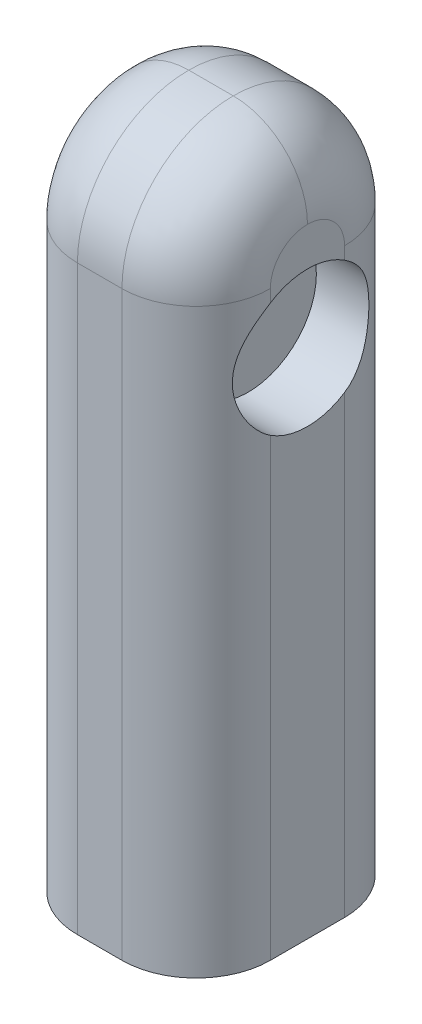
ISO-10303-21;
HEADER;
FILE_DESCRIPTION(('STEP AP214'),'2;1');
FILE_NAME('part.step','',(''),(''),'','','');
FILE_SCHEMA(('AUTOMOTIVE_DESIGN { 1 0 10303 214 1 1 1 1 }'));
ENDSEC;
DATA;
#1=APPLICATION_CONTEXT('core data for automotive mechanical design processes');
#2=APPLICATION_PROTOCOL_DEFINITION('international standard','automotive_design',2000,#1);
#3=PRODUCT_CONTEXT('',#1,'mechanical');
#4=PRODUCT('Part','Part','',(#3));
#5=PRODUCT_RELATED_PRODUCT_CATEGORY('part','',(#4));
#6=PRODUCT_DEFINITION_FORMATION('','',#4);
#7=PRODUCT_DEFINITION_CONTEXT('part definition',#1,'design');
#8=PRODUCT_DEFINITION('design','',#6,#7);
#9=PRODUCT_DEFINITION_SHAPE('','',#8);
#10=(LENGTH_UNIT() NAMED_UNIT(*) SI_UNIT(.MILLI.,.METRE.));
#11=(NAMED_UNIT(*) PLANE_ANGLE_UNIT() SI_UNIT($,.RADIAN.));
#12=(NAMED_UNIT(*) SI_UNIT($,.STERADIAN.) SOLID_ANGLE_UNIT());
#13=UNCERTAINTY_MEASURE_WITH_UNIT(LENGTH_MEASURE(1.E-05),#10,'distance_accuracy_value','');
#14=(GEOMETRIC_REPRESENTATION_CONTEXT(3) GLOBAL_UNCERTAINTY_ASSIGNED_CONTEXT((#13)) GLOBAL_UNIT_ASSIGNED_CONTEXT((#10,
#11,#12)) REPRESENTATION_CONTEXT('',''));
#15=CARTESIAN_POINT('',(0.,0.,0.));
#16=DIRECTION('',(0.,0.,1.));
#17=DIRECTION('',(1.,0.,0.));
#18=AXIS2_PLACEMENT_3D('',#15,#16,#17);
#19=CARTESIAN_POINT('',(13.,93.4,-15.));
#20=DIRECTION('',(-1.,0.,0.));
#21=DIRECTION('',(0.,0.,1.));
#22=AXIS2_PLACEMENT_3D('',#19,#20,#21);
#23=PLANE('',#22);
#24=DIRECTION('',(0.,0.,-1.));
#25=VECTOR('',#24,1.);
#26=CARTESIAN_POINT('',(13.,0.,-15.));
#27=LINE('',#26,#25);
#28=CARTESIAN_POINT('',(13.,0.,5.));
#29=VERTEX_POINT('',#28);
#30=CARTESIAN_POINT('',(13.,0.,-5.));
#31=VERTEX_POINT('',#30);
#32=EDGE_CURVE('E352',#29,#31,#27,.T.);
#33=ORIENTED_EDGE('',*,*,#32,.T.);
#34=DIRECTION('',(0.,-1.,0.));
#35=VECTOR('',#34,1.);
#36=CARTESIAN_POINT('',(13.,93.4,-5.));
#37=LINE('',#36,#35);
#38=CARTESIAN_POINT('',(13.,61.2773061694769,-5.));
#39=VERTEX_POINT('',#38);
#40=EDGE_CURVE('E298',#31,#39,#37,.F.);
#41=ORIENTED_EDGE('',*,*,#40,.T.);
#42=CARTESIAN_POINT('',(13.,69.,0.));
#43=DIRECTION('',(1.,0.,0.));
#44=DIRECTION('',(0.,0.,-1.));
#45=AXIS2_PLACEMENT_3D('',#42,#43,#44);
#46=CIRCLE('',#45,9.20000000000001);
#47=CARTESIAN_POINT('',(13.,61.2773061694769,5.));
#48=VERTEX_POINT('',#47);
#49=EDGE_CURVE('E290',#48,#39,#46,.T.);
#50=ORIENTED_EDGE('',*,*,#49,.F.);
#51=DIRECTION('',(0.,-1.,0.));
#52=VECTOR('',#51,1.);
#53=CARTESIAN_POINT('',(13.,93.4,5.));
#54=LINE('',#53,#52);
#55=EDGE_CURVE('E306',#48,#29,#54,.T.);
#56=ORIENTED_EDGE('',*,*,#55,.T.);
#57=EDGE_LOOP('',(#33,#41,#50,#56));
#58=FACE_BOUND('',#57,.T.);
#59=ADVANCED_FACE('F35',(#58),#23,.F.);
#60=CARTESIAN_POINT('',(-13.,93.4,-15.));
#61=DIRECTION('',(1.,0.,0.));
#62=DIRECTION('',(0.,0.,-1.));
#63=AXIS2_PLACEMENT_3D('',#60,#61,#62);
#64=PLANE('',#63);
#65=DIRECTION('',(0.,0.,1.));
#66=VECTOR('',#65,1.);
#67=CARTESIAN_POINT('',(-13.,0.,-15.));
#68=LINE('',#67,#66);
#69=CARTESIAN_POINT('',(-13.,0.,-5.));
#70=VERTEX_POINT('',#69);
#71=CARTESIAN_POINT('',(-13.,0.,5.));
#72=VERTEX_POINT('',#71);
#73=EDGE_CURVE('E357',#70,#72,#68,.T.);
#74=ORIENTED_EDGE('',*,*,#73,.T.);
#75=DIRECTION('',(0.,-1.,0.));
#76=VECTOR('',#75,1.);
#77=CARTESIAN_POINT('',(-13.,93.4,5.));
#78=LINE('',#77,#76);
#79=CARTESIAN_POINT('',(-13.,61.2773061694769,5.));
#80=VERTEX_POINT('',#79);
#81=EDGE_CURVE('E187',#72,#80,#78,.F.);
#82=ORIENTED_EDGE('',*,*,#81,.T.);
#83=CARTESIAN_POINT('',(-13.,69.,0.));
#84=DIRECTION('',(-1.,0.,0.));
#85=DIRECTION('',(0.,0.,1.));
#86=AXIS2_PLACEMENT_3D('',#83,#84,#85);
#87=CIRCLE('',#86,9.20000000000001);
#88=CARTESIAN_POINT('',(-13.,61.2773061694769,-5.));
#89=VERTEX_POINT('',#88);
#90=EDGE_CURVE('E343',#89,#80,#87,.T.);
#91=ORIENTED_EDGE('',*,*,#90,.F.);
#92=DIRECTION('',(0.,-1.,0.));
#93=VECTOR('',#92,1.);
#94=CARTESIAN_POINT('',(-13.,93.4,-5.));
#95=LINE('',#94,#93);
#96=EDGE_CURVE('E178',#89,#70,#95,.T.);
#97=ORIENTED_EDGE('',*,*,#96,.T.);
#98=EDGE_LOOP('',(#74,#82,#91,#97));
#99=FACE_BOUND('',#98,.T.);
#100=ADVANCED_FACE('F259',(#99),#64,.F.);
#101=CARTESIAN_POINT('',(13.,76.7226938305231,-5.));
#102=VERTEX_POINT('',#101);
#103=CARTESIAN_POINT('',(13.,76.7226938305231,5.));
#104=VERTEX_POINT('',#103);
#105=EDGE_CURVE('E281',#102,#104,#46,.T.);
#106=ORIENTED_EDGE('',*,*,#105,.F.);
#107=DIRECTION('',(0.,-1.,0.));
#108=VECTOR('',#107,1.);
#109=CARTESIAN_POINT('',(13.,93.4,-5.));
#110=LINE('',#109,#108);
#111=CARTESIAN_POINT('',(13.,78.4,-5.));
#112=VERTEX_POINT('',#111);
#113=EDGE_CURVE('E283',#102,#112,#110,.F.);
#114=ORIENTED_EDGE('',*,*,#113,.T.);
#115=CARTESIAN_POINT('',(13.,78.4,0.));
#116=DIRECTION('',(-1.,0.,0.));
#117=DIRECTION('',(0.,0.,1.));
#118=AXIS2_PLACEMENT_3D('',#115,#116,#117);
#119=CIRCLE('',#118,5.);
#120=CARTESIAN_POINT('',(13.,83.4,0.));
#121=VERTEX_POINT('',#120);
#122=EDGE_CURVE('E299',#112,#121,#119,.F.);
#123=ORIENTED_EDGE('',*,*,#122,.T.);
#124=CARTESIAN_POINT('',(13.,78.4,0.));
#125=DIRECTION('',(-1.,0.,0.));
#126=DIRECTION('',(0.,0.,1.));
#127=AXIS2_PLACEMENT_3D('',#124,#125,#126);
#128=CIRCLE('',#127,5.);
#129=CARTESIAN_POINT('',(13.,78.4,5.));
#130=VERTEX_POINT('',#129);
#131=EDGE_CURVE('E301',#121,#130,#128,.F.);
#132=ORIENTED_EDGE('',*,*,#131,.T.);
#133=DIRECTION('',(0.,-1.,0.));
#134=VECTOR('',#133,1.);
#135=CARTESIAN_POINT('',(13.,93.4,5.));
#136=LINE('',#135,#134);
#137=EDGE_CURVE('E286',#130,#104,#136,.T.);
#138=ORIENTED_EDGE('',*,*,#137,.T.);
#139=EDGE_LOOP('',(#106,#114,#123,#132,#138));
#140=FACE_BOUND('',#139,.T.);
#141=ADVANCED_FACE('F262',(#140),#23,.F.);
#142=CARTESIAN_POINT('',(-13.,93.4,-15.));
#143=DIRECTION('',(0.,0.,1.));
#144=DIRECTION('',(1.,0.,0.));
#145=AXIS2_PLACEMENT_3D('',#142,#143,#144);
#146=PLANE('',#145);
#147=DIRECTION('',(-1.,0.,0.));
#148=VECTOR('',#147,1.);
#149=CARTESIAN_POINT('',(13.,78.4,-15.));
#150=LINE('',#149,#148);
#151=CARTESIAN_POINT('',(-3.00000000000001,78.4,-15.));
#152=VERTEX_POINT('',#151);
#153=CARTESIAN_POINT('',(2.99999999999999,78.4,-15.));
#154=VERTEX_POINT('',#153);
#155=EDGE_CURVE('E142',#152,#154,#150,.F.);
#156=ORIENTED_EDGE('',*,*,#155,.T.);
#157=DIRECTION('',(0.,-1.,0.));
#158=VECTOR('',#157,1.);
#159=CARTESIAN_POINT('',(2.99999999999999,93.4,-15.));
#160=LINE('',#159,#158);
#161=CARTESIAN_POINT('',(2.99999999999999,0.,-15.));
#162=VERTEX_POINT('',#161);
#163=EDGE_CURVE('E312',#154,#162,#160,.T.);
#164=ORIENTED_EDGE('',*,*,#163,.T.);
#165=DIRECTION('',(-1.,0.,0.));
#166=VECTOR('',#165,1.);
#167=CARTESIAN_POINT('',(-13.,0.,-15.));
#168=LINE('',#167,#166);
#169=CARTESIAN_POINT('',(-3.00000000000001,0.,-15.));
#170=VERTEX_POINT('',#169);
#171=EDGE_CURVE('E355',#162,#170,#168,.T.);
#172=ORIENTED_EDGE('',*,*,#171,.T.);
#173=DIRECTION('',(0.,-1.,0.));
#174=VECTOR('',#173,1.);
#175=CARTESIAN_POINT('',(-3.00000000000001,93.4,-15.));
#176=LINE('',#175,#174);
#177=EDGE_CURVE('E315',#170,#152,#176,.F.);
#178=ORIENTED_EDGE('',*,*,#177,.T.);
#179=EDGE_LOOP('',(#156,#164,#172,#178));
#180=FACE_BOUND('',#179,.T.);
#181=ADVANCED_FACE('F273',(#180),#146,.F.);
#182=CARTESIAN_POINT('',(-13.,76.7226938305231,5.));
#183=VERTEX_POINT('',#182);
#184=CARTESIAN_POINT('',(-13.,76.7226938305231,-5.));
#185=VERTEX_POINT('',#184);
#186=EDGE_CURVE('E344',#183,#185,#87,.T.);
#187=ORIENTED_EDGE('',*,*,#186,.F.);
#188=DIRECTION('',(0.,-1.,0.));
#189=VECTOR('',#188,1.);
#190=CARTESIAN_POINT('',(-13.,93.4,5.));
#191=LINE('',#190,#189);
#192=CARTESIAN_POINT('',(-13.,78.4,5.));
#193=VERTEX_POINT('',#192);
#194=EDGE_CURVE('E185',#183,#193,#191,.F.);
#195=ORIENTED_EDGE('',*,*,#194,.T.);
#196=CARTESIAN_POINT('',(-13.,78.4,0.));
#197=DIRECTION('',(1.,0.,0.));
#198=DIRECTION('',(0.,0.,-1.));
#199=AXIS2_PLACEMENT_3D('',#196,#197,#198);
#200=CIRCLE('',#199,5.);
#201=CARTESIAN_POINT('',(-13.,83.4,0.));
#202=VERTEX_POINT('',#201);
#203=EDGE_CURVE('E160',#193,#202,#200,.F.);
#204=ORIENTED_EDGE('',*,*,#203,.T.);
#205=CARTESIAN_POINT('',(-13.,78.4,0.));
#206=DIRECTION('',(1.,0.,0.));
#207=DIRECTION('',(0.,0.,-1.));
#208=AXIS2_PLACEMENT_3D('',#205,#206,#207);
#209=CIRCLE('',#208,5.);
#210=CARTESIAN_POINT('',(-13.,78.4,-5.));
#211=VERTEX_POINT('',#210);
#212=EDGE_CURVE('E182',#202,#211,#209,.F.);
#213=ORIENTED_EDGE('',*,*,#212,.T.);
#214=DIRECTION('',(0.,-1.,0.));
#215=VECTOR('',#214,1.);
#216=CARTESIAN_POINT('',(-13.,93.4,-5.));
#217=LINE('',#216,#215);
#218=EDGE_CURVE('E180',#211,#185,#217,.T.);
#219=ORIENTED_EDGE('',*,*,#218,.T.);
#220=EDGE_LOOP('',(#187,#195,#204,#213,#219));
#221=FACE_BOUND('',#220,.T.);
#222=ADVANCED_FACE('F268',(#221),#64,.F.);
#223=CARTESIAN_POINT('',(-13.,93.4,15.));
#224=DIRECTION('',(0.,0.,-1.));
#225=DIRECTION('',(-1.,0.,0.));
#226=AXIS2_PLACEMENT_3D('',#223,#224,#225);
#227=PLANE('',#226);
#228=DIRECTION('',(1.,0.,0.));
#229=VECTOR('',#228,1.);
#230=CARTESIAN_POINT('',(-13.,0.,15.));
#231=LINE('',#230,#229);
#232=CARTESIAN_POINT('',(-3.00000000000001,0.,15.));
#233=VERTEX_POINT('',#232);
#234=CARTESIAN_POINT('',(2.99999999999999,0.,15.));
#235=VERTEX_POINT('',#234);
#236=EDGE_CURVE('E143',#233,#235,#231,.T.);
#237=ORIENTED_EDGE('',*,*,#236,.T.);
#238=DIRECTION('',(0.,-1.,0.));
#239=VECTOR('',#238,1.);
#240=CARTESIAN_POINT('',(2.99999999999999,93.4,15.));
#241=LINE('',#240,#239);
#242=CARTESIAN_POINT('',(2.99999999999999,78.4,15.));
#243=VERTEX_POINT('',#242);
#244=EDGE_CURVE('E11',#235,#243,#241,.F.);
#245=ORIENTED_EDGE('',*,*,#244,.T.);
#246=DIRECTION('',(1.,0.,0.));
#247=VECTOR('',#246,1.);
#248=CARTESIAN_POINT('',(-13.,78.4,15.));
#249=LINE('',#248,#247);
#250=CARTESIAN_POINT('',(-3.00000000000001,78.4,15.));
#251=VERTEX_POINT('',#250);
#252=EDGE_CURVE('E135',#243,#251,#249,.F.);
#253=ORIENTED_EDGE('',*,*,#252,.T.);
#254=DIRECTION('',(0.,-1.,0.));
#255=VECTOR('',#254,1.);
#256=CARTESIAN_POINT('',(-3.00000000000001,93.4,15.));
#257=LINE('',#256,#255);
#258=EDGE_CURVE('E139',#251,#233,#257,.T.);
#259=ORIENTED_EDGE('',*,*,#258,.T.);
#260=EDGE_LOOP('',(#237,#245,#253,#259));
#261=FACE_BOUND('',#260,.T.);
#262=ADVANCED_FACE('F137',(#261),#227,.F.);
#263=CARTESIAN_POINT('',(0.,0.,0.));
#264=DIRECTION('',(0.,1.,0.));
#265=DIRECTION('',(0.,0.,1.));
#266=AXIS2_PLACEMENT_3D('',#263,#264,#265);
#267=PLANE('',#266);
#268=ORIENTED_EDGE('',*,*,#171,.F.);
#269=CARTESIAN_POINT('',(2.99999999999999,0.,-5.));
#270=DIRECTION('',(0.,1.,0.));
#271=DIRECTION('',(0.,0.,1.));
#272=AXIS2_PLACEMENT_3D('',#269,#270,#271);
#273=CIRCLE('',#272,10.);
#274=EDGE_CURVE('E308',#162,#31,#273,.F.);
#275=ORIENTED_EDGE('',*,*,#274,.T.);
#276=ORIENTED_EDGE('',*,*,#32,.F.);
#277=CARTESIAN_POINT('',(2.99999999999999,0.,5.));
#278=DIRECTION('',(0.,1.,0.));
#279=DIRECTION('',(0.,0.,1.));
#280=AXIS2_PLACEMENT_3D('',#277,#278,#279);
#281=CIRCLE('',#280,10.);
#282=EDGE_CURVE('E310',#29,#235,#281,.F.);
#283=ORIENTED_EDGE('',*,*,#282,.T.);
#284=ORIENTED_EDGE('',*,*,#236,.F.);
#285=CARTESIAN_POINT('',(-3.00000000000001,0.,5.));
#286=DIRECTION('',(0.,1.,0.));
#287=DIRECTION('',(0.,0.,1.));
#288=AXIS2_PLACEMENT_3D('',#285,#286,#287);
#289=CIRCLE('',#288,10.);
#290=EDGE_CURVE('E168',#233,#72,#289,.F.);
#291=ORIENTED_EDGE('',*,*,#290,.T.);
#292=ORIENTED_EDGE('',*,*,#73,.F.);
#293=CARTESIAN_POINT('',(-3.00000000000001,0.,-5.));
#294=DIRECTION('',(0.,1.,0.));
#295=DIRECTION('',(0.,0.,1.));
#296=AXIS2_PLACEMENT_3D('',#293,#294,#295);
#297=CIRCLE('',#296,10.);
#298=EDGE_CURVE('E169',#70,#170,#297,.F.);
#299=ORIENTED_EDGE('',*,*,#298,.T.);
#300=EDGE_LOOP('',(#268,#275,#276,#283,#284,#291,#292,#299));
#301=FACE_BOUND('',#300,.T.);
#302=ADVANCED_FACE('F222',(#301),#267,.F.);
#303=CARTESIAN_POINT('',(4.99999999999999,69.,0.));
#304=DIRECTION('',(1.,0.,0.));
#305=DIRECTION('',(0.,0.,-1.));
#306=AXIS2_PLACEMENT_3D('',#303,#304,#305);
#307=CYLINDRICAL_SURFACE('',#306,9.20000000000001);
#308=CARTESIAN_POINT('',(4.99999999999999,69.,0.));
#309=DIRECTION('',(1.,0.,0.));
#310=DIRECTION('',(0.,0.,-1.));
#311=AXIS2_PLACEMENT_3D('',#308,#309,#310);
#312=CIRCLE('',#311,9.20000000000001);
#313=CARTESIAN_POINT('',(4.99999999999999,69.,-9.20000000000001));
#314=VERTEX_POINT('',#313);
#315=EDGE_CURVE('E289',#314,#314,#312,.T.);
#316=ORIENTED_EDGE('',*,*,#315,.F.);
#317=EDGE_LOOP('',(#316));
#318=FACE_BOUND('',#317,.T.);
#319=ORIENTED_EDGE('',*,*,#49,.T.);
#320=CARTESIAN_POINT('',(13.,61.2773061694769,-5.));
#321=CARTESIAN_POINT('',(13.0000211878669,61.4133292565048,-5.21017069857473));
#322=CARTESIAN_POINT('',(12.9933763169044,61.5579303374883,-5.41463732350999));
#323=CARTESIAN_POINT('',(12.9690623234664,61.8627851263489,-5.81053362983726));
#324=CARTESIAN_POINT('',(12.9514047269152,62.0230223217438,-6.00197670963923));
#325=CARTESIAN_POINT('',(12.9074463891745,62.3573062481909,-6.36994918833823));
#326=CARTESIAN_POINT('',(12.8811783942607,62.5312987927299,-6.54653195369761));
#327=CARTESIAN_POINT('',(12.822298079851,62.8924008450748,-6.88465076405807));
#328=CARTESIAN_POINT('',(12.7896841161868,63.079513744162,-7.04618289353642));
#329=CARTESIAN_POINT('',(12.7205380234983,63.4649767868942,-7.35282066418935));
#330=CARTESIAN_POINT('',(12.6840197593966,63.6632860587078,-7.4979809028003));
#331=CARTESIAN_POINT('',(12.6092180557172,64.0706202857481,-7.77183641948112));
#332=CARTESIAN_POINT('',(12.5709347437293,64.2796444665483,-7.90053288513648));
#333=CARTESIAN_POINT('',(12.4947382847504,64.7076288124663,-8.14099937147628));
#334=CARTESIAN_POINT('',(12.4568256543547,64.9266009510135,-8.25274825271848));
#335=CARTESIAN_POINT('',(12.3835325580618,65.3731354809686,-8.45850367474591));
#336=CARTESIAN_POINT('',(12.3481520397827,65.6006976945243,-8.55251058262633));
#337=CARTESIAN_POINT('',(12.2798098108575,66.0778905956585,-8.72753559873593));
#338=CARTESIAN_POINT('',(12.247143394094,66.3280059921713,-8.80735333420831));
#339=CARTESIAN_POINT('',(12.1890600212206,66.8349539144931,-8.94547864086686));
#340=CARTESIAN_POINT('',(12.1636432400247,67.0917866022089,-9.00378569306879));
#341=CARTESIAN_POINT('',(12.1218164995084,67.6099436327844,-9.0981870353921));
#342=CARTESIAN_POINT('',(12.1053964840756,67.8712626226187,-9.13430613154151));
#343=CARTESIAN_POINT('',(12.0826843243695,68.3964665118966,-9.18396992413529));
#344=CARTESIAN_POINT('',(12.0763911837865,68.6603511563541,-9.19751684129662));
#345=CARTESIAN_POINT('',(12.0744564904245,69.1679602495431,-9.20169333857702));
#346=CARTESIAN_POINT('',(12.0780307652826,69.4116696810819,-9.19401005693875));
#347=CARTESIAN_POINT('',(12.0939575646536,69.8974140636107,-9.15936292324619));
#348=CARTESIAN_POINT('',(12.106309724881,70.1394490836686,-9.1323998713092));
#349=CARTESIAN_POINT('',(12.139048423471,70.6201675740098,-9.05948062293808));
#350=CARTESIAN_POINT('',(12.1594379406969,70.8588497676381,-9.01351738420976));
#351=CARTESIAN_POINT('',(12.2070492347078,71.3311818450078,-8.90305692801301));
#352=CARTESIAN_POINT('',(12.2342711731534,71.5648316095358,-8.83855927200057));
#353=CARTESIAN_POINT('',(12.2935915082107,72.0225283482456,-8.69259640966494));
#354=CARTESIAN_POINT('',(12.3256177803897,72.2466631448172,-8.61137645631008));
#355=CARTESIAN_POINT('',(12.3931175968267,72.6875864549054,-8.43198537455088));
#356=CARTESIAN_POINT('',(12.4285923047685,72.9043724550339,-8.33380851525079));
#357=CARTESIAN_POINT('',(12.5011502644062,73.3296137651585,-8.12102271911926));
#358=CARTESIAN_POINT('',(12.5382345206608,73.5380637118556,-8.00640341423061));
#359=CARTESIAN_POINT('',(12.612043597462,73.945517448,-7.76133860498217));
#360=CARTESIAN_POINT('',(12.6487684100485,74.1445210286233,-7.63089275098286));
#361=CARTESIAN_POINT('',(12.7201351597275,74.5336695810405,-7.35364090720784));
#362=CARTESIAN_POINT('',(12.754757953932,74.7237303636859,-7.20671169352456));
#363=CARTESIAN_POINT('',(12.8194801520927,75.0921588143927,-6.89806632485707));
#364=CARTESIAN_POINT('',(12.8495813185979,75.2705310233426,-6.73635597136692));
#365=CARTESIAN_POINT('',(12.9030812252173,75.6141346164605,-6.39929748232313));
#366=CARTESIAN_POINT('',(12.9264958913946,75.7793965367017,-6.22398303884036));
#367=CARTESIAN_POINT('',(12.9645864398447,76.0959981869023,-5.86044584106881));
#368=CARTESIAN_POINT('',(12.9792685566589,76.2473477840395,-5.67223240324911));
#369=CARTESIAN_POINT('',(12.9922888547187,76.4488889993812,-5.40032170461297));
#370=CARTESIAN_POINT('',(12.9951499213604,76.5054233985231,-5.32146961356018));
#371=CARTESIAN_POINT('',(12.9990050128469,76.6159624328498,-5.16202648962182));
#372=CARTESIAN_POINT('',(12.9999999781462,76.6699683289296,-5.08143635338));
#373=CARTESIAN_POINT('',(13.,76.7226938305231,-5.));
#374=B_SPLINE_CURVE_WITH_KNOTS('',3,(#320,#321,#322,#323,#324,#325,#326,#327,#328,#329,#330,
#331,#332,#333,#334,#335,#336,#337,#338,#339,#340,#341,#342,#343,#344,#345,#346,#347,#348,#349,
#350,#351,#352,#353,#354,#355,#356,#357,#358,#359,#360,#361,#362,#363,#364,#365,#366,#367,#368,
#369,#370,#371,#372,#373),.UNSPECIFIED.,.F.,.F.,(4,2,2,2,2,2,2,2,2,2,2,2,2,2,2,2,2,2,2,2,2,2,2,
2,2,2,4),(0.,0.7505620305655,1.50033983769795,2.24729861561583,2.99445118037251,
3.73903345136069,4.48356198288751,5.22901169059721,5.97444597268299,6.76711134977045,
7.55979585009697,8.3515925123783,9.14331127078901,9.87396038427969,10.604579177333,
11.3354690125836,12.0663761428889,12.7872428530935,13.5083536717937,14.2299212141138,
14.9515047001803,15.6788958216998,16.4060026632618,17.1313629380154,17.8562047233972,
18.1473510156795,18.4383505402313),.UNSPECIFIED.);
#375=EDGE_CURVE('E234',#39,#102,#374,.T.);
#376=ORIENTED_EDGE('',*,*,#375,.T.);
#377=ORIENTED_EDGE('',*,*,#105,.T.);
#378=CARTESIAN_POINT('',(13.,76.7226938305231,5.));
#379=CARTESIAN_POINT('',(13.0000211878669,76.5866707434952,5.21017069857472));
#380=CARTESIAN_POINT('',(12.9933763169044,76.4420696625117,5.41463732350999));
#381=CARTESIAN_POINT('',(12.9690623234664,76.1372148736511,5.81053362983725));
#382=CARTESIAN_POINT('',(12.9514047269152,75.9769776782562,6.00197670963923));
#383=CARTESIAN_POINT('',(12.9074463891745,75.6426937518091,6.36994918833823));
#384=CARTESIAN_POINT('',(12.8811783942607,75.4687012072701,6.54653195369761));
#385=CARTESIAN_POINT('',(12.822298079851,75.1075991549253,6.88465076405806));
#386=CARTESIAN_POINT('',(12.7896841161868,74.9204862558381,7.04618289353641));
#387=CARTESIAN_POINT('',(12.7205380234983,74.5350232131058,7.35282066418935));
#388=CARTESIAN_POINT('',(12.6840197593966,74.3367139412922,7.4979809028003));
#389=CARTESIAN_POINT('',(12.6092180557172,73.9293797142519,7.77183641948113));
#390=CARTESIAN_POINT('',(12.5709347437293,73.7203555334517,7.90053288513649));
#391=CARTESIAN_POINT('',(12.4947382847504,73.2923711875337,8.14099937147629));
#392=CARTESIAN_POINT('',(12.4568256543547,73.0733990489865,8.25274825271848));
#393=CARTESIAN_POINT('',(12.3835325580618,72.6268645190314,8.45850367474591));
#394=CARTESIAN_POINT('',(12.3481520397827,72.3993023054757,8.55251058262633));
#395=CARTESIAN_POINT('',(12.2798098108575,71.9221094043415,8.72753559873592));
#396=CARTESIAN_POINT('',(12.247143394094,71.6719940078287,8.80735333420831));
#397=CARTESIAN_POINT('',(12.1890600212206,71.1650460855069,8.94547864086686));
#398=CARTESIAN_POINT('',(12.1636432400247,70.9082133977912,9.00378569306878));
#399=CARTESIAN_POINT('',(12.1218164995084,70.3900563672157,9.09818703539209));
#400=CARTESIAN_POINT('',(12.1053964840756,70.1287373773814,9.13430613154151));
#401=CARTESIAN_POINT('',(12.0826843243695,69.6035334881034,9.18396992413529));
#402=CARTESIAN_POINT('',(12.0763911837865,69.3396488436459,9.19751684129662));
#403=CARTESIAN_POINT('',(12.0744564904245,68.8320397504569,9.20169333857702));
#404=CARTESIAN_POINT('',(12.0780307652826,68.5883303189181,9.19401005693875));
#405=CARTESIAN_POINT('',(12.0939575646536,68.1025859363893,9.15936292324619));
#406=CARTESIAN_POINT('',(12.106309724881,67.8605509163314,9.1323998713092));
#407=CARTESIAN_POINT('',(12.139048423471,67.3798324259903,9.05948062293808));
#408=CARTESIAN_POINT('',(12.1594379406969,67.141150232362,9.01351738420976));
#409=CARTESIAN_POINT('',(12.2070492347078,66.6688181549923,8.90305692801302));
#410=CARTESIAN_POINT('',(12.2342711731533,66.4351683904642,8.83855927200057));
#411=CARTESIAN_POINT('',(12.2935915082107,65.9774716517544,8.69259640966495));
#412=CARTESIAN_POINT('',(12.3256177803897,65.7533368551828,8.61137645631008));
#413=CARTESIAN_POINT('',(12.3931175968267,65.3124135450946,8.43198537455087));
#414=CARTESIAN_POINT('',(12.4285923047685,65.0956275449661,8.33380851525079));
#415=CARTESIAN_POINT('',(12.5011502644062,64.6703862348415,8.12102271911925));
#416=CARTESIAN_POINT('',(12.5382345206608,64.4619362881444,8.0064034142306));
#417=CARTESIAN_POINT('',(12.612043597462,64.054482552,7.76133860498217));
#418=CARTESIAN_POINT('',(12.6487684100485,63.8554789713767,7.63089275098286));
#419=CARTESIAN_POINT('',(12.7201351597275,63.4663304189595,7.35364090720784));
#420=CARTESIAN_POINT('',(12.754757953932,63.2762696363141,7.20671169352456));
#421=CARTESIAN_POINT('',(12.8194801520927,62.9078411856073,6.89806632485707));
#422=CARTESIAN_POINT('',(12.8495813185979,62.7294689766574,6.73635597136692));
#423=CARTESIAN_POINT('',(12.9030812252173,62.3858653835395,6.39929748232313));
#424=CARTESIAN_POINT('',(12.9264958913946,62.2206034632983,6.22398303884036));
#425=CARTESIAN_POINT('',(12.9645864398447,61.9040018130977,5.86044584106881));
#426=CARTESIAN_POINT('',(12.9792685566589,61.7526522159605,5.6722324032491));
#427=CARTESIAN_POINT('',(12.9922888547187,61.5511110006188,5.40032170461296));
#428=CARTESIAN_POINT('',(12.9951499213604,61.4945766014769,5.32146961356017));
#429=CARTESIAN_POINT('',(12.999005012847,61.3840375671502,5.16202648962182));
#430=CARTESIAN_POINT('',(12.9999999781462,61.3300316710704,5.08143635337999));
#431=CARTESIAN_POINT('',(13.,61.2773061694769,5.));
#432=B_SPLINE_CURVE_WITH_KNOTS('',3,(#378,#379,#380,#381,#382,#383,#384,#385,#386,#387,#388,
#389,#390,#391,#392,#393,#394,#395,#396,#397,#398,#399,#400,#401,#402,#403,#404,#405,#406,#407,
#408,#409,#410,#411,#412,#413,#414,#415,#416,#417,#418,#419,#420,#421,#422,#423,#424,#425,#426,
#427,#428,#429,#430,#431),.UNSPECIFIED.,.F.,.F.,(4,2,2,2,2,2,2,2,2,2,2,2,2,2,2,2,2,2,2,2,2,2,2,
2,2,2,4),(0.,0.7505620305655,1.50033983769794,2.24729861561582,2.9944511803725,3.73903345136069,
4.48356198288753,5.22901169059723,5.97444597268298,6.76711134977045,7.55979585009695,
8.3515925123783,9.14331127078899,9.87396038427969,10.6045791773329,11.3354690125836,
12.0663761428889,12.7872428530935,13.5083536717937,14.2299212141138,14.9515047001803,
15.6788958216999,16.4060026632618,17.1313629380154,17.8562047233972,18.1473510156795,
18.4383505402313),.UNSPECIFIED.);
#433=EDGE_CURVE('E227',#104,#48,#432,.T.);
#434=ORIENTED_EDGE('',*,*,#433,.T.);
#435=EDGE_LOOP('',(#319,#376,#377,#434));
#436=FACE_BOUND('',#435,.T.);
#437=ADVANCED_FACE('F217',(#318,#436),#307,.F.);
#438=CARTESIAN_POINT('',(4.99999999999999,69.,0.));
#439=DIRECTION('',(1.,0.,0.));
#440=DIRECTION('',(0.,0.,-1.));
#441=AXIS2_PLACEMENT_3D('',#438,#439,#440);
#442=PLANE('',#441);
#443=ORIENTED_EDGE('',*,*,#315,.T.);
#444=EDGE_LOOP('',(#443));
#445=FACE_BOUND('',#444,.T.);
#446=ADVANCED_FACE('F212',(#445),#442,.T.);
#447=CARTESIAN_POINT('',(-5.00000000000001,69.,0.));
#448=DIRECTION('',(-1.,0.,0.));
#449=DIRECTION('',(0.,0.,1.));
#450=AXIS2_PLACEMENT_3D('',#447,#448,#449);
#451=CYLINDRICAL_SURFACE('',#450,9.20000000000001);
#452=CARTESIAN_POINT('',(-5.00000000000001,69.,0.));
#453=DIRECTION('',(-1.,0.,0.));
#454=DIRECTION('',(0.,0.,1.));
#455=AXIS2_PLACEMENT_3D('',#452,#453,#454);
#456=CIRCLE('',#455,9.20000000000001);
#457=CARTESIAN_POINT('',(-5.00000000000001,69.,9.20000000000001));
#458=VERTEX_POINT('',#457);
#459=EDGE_CURVE('E348',#458,#458,#456,.T.);
#460=ORIENTED_EDGE('',*,*,#459,.F.);
#461=EDGE_LOOP('',(#460));
#462=FACE_BOUND('',#461,.T.);
#463=ORIENTED_EDGE('',*,*,#90,.T.);
#464=CARTESIAN_POINT('',(-13.,61.2773061694769,5.));
#465=CARTESIAN_POINT('',(-13.0000211878669,61.4133292565048,5.21017069857473));
#466=CARTESIAN_POINT('',(-12.9933763169044,61.5579303374883,5.41463732350999));
#467=CARTESIAN_POINT('',(-12.9690623234664,61.8627851263489,5.81053362983725));
#468=CARTESIAN_POINT('',(-12.9514047269152,62.0230223217438,6.00197670963923));
#469=CARTESIAN_POINT('',(-12.9074463891745,62.3573062481909,6.36994918833823));
#470=CARTESIAN_POINT('',(-12.8811783942607,62.5312987927299,6.5465319536976));
#471=CARTESIAN_POINT('',(-12.822298079851,62.8924008450748,6.88465076405805));
#472=CARTESIAN_POINT('',(-12.7896841161868,63.0795137441619,7.04618289353641));
#473=CARTESIAN_POINT('',(-12.7205380234983,63.4649767868942,7.35282066418935));
#474=CARTESIAN_POINT('',(-12.6840197593967,63.6632860587078,7.49798090280029));
#475=CARTESIAN_POINT('',(-12.6092180557172,64.0706202857481,7.77183641948112));
#476=CARTESIAN_POINT('',(-12.5709347437293,64.2796444665483,7.90053288513648));
#477=CARTESIAN_POINT('',(-12.4947382847504,64.7076288124663,8.14099937147628));
#478=CARTESIAN_POINT('',(-12.4568256543547,64.9266009510135,8.25274825271847));
#479=CARTESIAN_POINT('',(-12.3835325580619,65.3731354809686,8.4585036747459));
#480=CARTESIAN_POINT('',(-12.3481520397827,65.6006976945243,8.55251058262633));
#481=CARTESIAN_POINT('',(-12.2798098108575,66.0778905956585,8.72753559873592));
#482=CARTESIAN_POINT('',(-12.247143394094,66.3280059921713,8.80735333420831));
#483=CARTESIAN_POINT('',(-12.1890600212206,66.8349539144931,8.94547864086686));
#484=CARTESIAN_POINT('',(-12.1636432400247,67.0917866022088,9.00378569306878));
#485=CARTESIAN_POINT('',(-12.1218164995084,67.6099436327844,9.09818703539209));
#486=CARTESIAN_POINT('',(-12.1053964840757,67.8712626226187,9.13430613154151));
#487=CARTESIAN_POINT('',(-12.0826843243695,68.3964665118966,9.18396992413529));
#488=CARTESIAN_POINT('',(-12.0763911837866,68.6603511563541,9.19751684129662));
#489=CARTESIAN_POINT('',(-12.0744564904245,69.1679602495431,9.20169333857702));
#490=CARTESIAN_POINT('',(-12.0780307652826,69.4116696810819,9.19401005693875));
#491=CARTESIAN_POINT('',(-12.0939575646536,69.8974140636107,9.15936292324619));
#492=CARTESIAN_POINT('',(-12.106309724881,70.1394490836686,9.1323998713092));
#493=CARTESIAN_POINT('',(-12.139048423471,70.6201675740097,9.05948062293808));
#494=CARTESIAN_POINT('',(-12.1594379406969,70.8588497676381,9.01351738420976));
#495=CARTESIAN_POINT('',(-12.2070492347078,71.3311818450077,8.90305692801302));
#496=CARTESIAN_POINT('',(-12.2342711731534,71.5648316095358,8.83855927200057));
#497=CARTESIAN_POINT('',(-12.2935915082107,72.0225283482456,8.69259640966495));
#498=CARTESIAN_POINT('',(-12.3256177803897,72.2466631448172,8.61137645631008));
#499=CARTESIAN_POINT('',(-12.3931175968267,72.6875864549054,8.43198537455087));
#500=CARTESIAN_POINT('',(-12.4285923047685,72.9043724550339,8.33380851525079));
#501=CARTESIAN_POINT('',(-12.5011502644062,73.3296137651585,8.12102271911925));
#502=CARTESIAN_POINT('',(-12.5382345206608,73.5380637118556,8.0064034142306));
#503=CARTESIAN_POINT('',(-12.612043597462,73.945517448,7.76133860498217));
#504=CARTESIAN_POINT('',(-12.6487684100485,74.1445210286233,7.63089275098287));
#505=CARTESIAN_POINT('',(-12.7201351597275,74.5336695810405,7.35364090720785));
#506=CARTESIAN_POINT('',(-12.754757953932,74.7237303636859,7.20671169352457));
#507=CARTESIAN_POINT('',(-12.8194801520927,75.0921588143927,6.89806632485707));
#508=CARTESIAN_POINT('',(-12.8495813185979,75.2705310233426,6.73635597136692));
#509=CARTESIAN_POINT('',(-12.9030812252174,75.6141346164605,6.39929748232313));
#510=CARTESIAN_POINT('',(-12.9264958913946,75.7793965367017,6.22398303884036));
#511=CARTESIAN_POINT('',(-12.9645864398447,76.0959981869023,5.86044584106882));
#512=CARTESIAN_POINT('',(-12.9792685566589,76.2473477840395,5.67223240324912));
#513=CARTESIAN_POINT('',(-12.9922888547187,76.4488889993812,5.40032170461297));
#514=CARTESIAN_POINT('',(-12.9951499213604,76.5054233985231,5.32146961356018));
#515=CARTESIAN_POINT('',(-12.999005012847,76.6159624328498,5.16202648962182));
#516=CARTESIAN_POINT('',(-12.9999999781462,76.6699683289296,5.08143635337999));
#517=CARTESIAN_POINT('',(-13.,76.7226938305231,5.));
#518=B_SPLINE_CURVE_WITH_KNOTS('',3,(#464,#465,#466,#467,#468,#469,#470,#471,#472,#473,#474,
#475,#476,#477,#478,#479,#480,#481,#482,#483,#484,#485,#486,#487,#488,#489,#490,#491,#492,#493,
#494,#495,#496,#497,#498,#499,#500,#501,#502,#503,#504,#505,#506,#507,#508,#509,#510,#511,#512,
#513,#514,#515,#516,#517),.UNSPECIFIED.,.F.,.F.,(4,2,2,2,2,2,2,2,2,2,2,2,2,2,2,2,2,2,2,2,2,2,2,
2,2,2,4),(0.,0.750562030565491,1.50033983769795,2.24729861561581,2.9944511803725,
3.73903345136067,4.48356198288751,5.22901169059721,5.97444597268298,6.76711134977045,
7.55979585009694,8.3515925123783,9.14331127078898,9.87396038427967,10.6045791773329,
11.3354690125836,12.0663761428889,12.7872428530935,13.5083536717937,14.2299212141138,
14.9515047001803,15.6788958216998,16.4060026632618,17.1313629380154,17.8562047233972,
18.1473510156795,18.4383505402313),.UNSPECIFIED.);
#519=EDGE_CURVE('E154',#80,#183,#518,.T.);
#520=ORIENTED_EDGE('',*,*,#519,.T.);
#521=ORIENTED_EDGE('',*,*,#186,.T.);
#522=CARTESIAN_POINT('',(-13.,76.7226938305231,-5.));
#523=CARTESIAN_POINT('',(-13.0000211878669,76.5866707434952,-5.21017069857472));
#524=CARTESIAN_POINT('',(-12.9933763169044,76.4420696625117,-5.41463732350998));
#525=CARTESIAN_POINT('',(-12.9690623234664,76.1372148736511,-5.81053362983725));
#526=CARTESIAN_POINT('',(-12.9514047269152,75.9769776782562,-6.00197670963922));
#527=CARTESIAN_POINT('',(-12.9074463891745,75.6426937518091,-6.36994918833823));
#528=CARTESIAN_POINT('',(-12.8811783942607,75.4687012072701,-6.54653195369761));
#529=CARTESIAN_POINT('',(-12.822298079851,75.1075991549252,-6.88465076405807));
#530=CARTESIAN_POINT('',(-12.7896841161868,74.9204862558381,-7.04618289353642));
#531=CARTESIAN_POINT('',(-12.7205380234983,74.5350232131058,-7.35282066418935));
#532=CARTESIAN_POINT('',(-12.6840197593967,74.3367139412922,-7.49798090280029));
#533=CARTESIAN_POINT('',(-12.6092180557172,73.9293797142519,-7.77183641948112));
#534=CARTESIAN_POINT('',(-12.5709347437293,73.7203555334517,-7.90053288513649));
#535=CARTESIAN_POINT('',(-12.4947382847504,73.2923711875337,-8.14099937147629));
#536=CARTESIAN_POINT('',(-12.4568256543547,73.0733990489865,-8.25274825271848));
#537=CARTESIAN_POINT('',(-12.3835325580619,72.6268645190314,-8.45850367474591));
#538=CARTESIAN_POINT('',(-12.3481520397827,72.3993023054757,-8.55251058262633));
#539=CARTESIAN_POINT('',(-12.2798098108575,71.9221094043414,-8.72753559873593));
#540=CARTESIAN_POINT('',(-12.247143394094,71.6719940078287,-8.80735333420831));
#541=CARTESIAN_POINT('',(-12.1890600212206,71.1650460855069,-8.94547864086686));
#542=CARTESIAN_POINT('',(-12.1636432400247,70.9082133977911,-9.00378569306878));
#543=CARTESIAN_POINT('',(-12.1218164995084,70.3900563672156,-9.09818703539209));
#544=CARTESIAN_POINT('',(-12.1053964840757,70.1287373773813,-9.1343061315415));
#545=CARTESIAN_POINT('',(-12.0826843243695,69.6035334881033,-9.18396992413529));
#546=CARTESIAN_POINT('',(-12.0763911837866,69.3396488436459,-9.19751684129661));
#547=CARTESIAN_POINT('',(-12.0744564904245,68.8320397504569,-9.20169333857701));
#548=CARTESIAN_POINT('',(-12.0780307652826,68.5883303189181,-9.19401005693874));
#549=CARTESIAN_POINT('',(-12.0939575646536,68.1025859363893,-9.15936292324618));
#550=CARTESIAN_POINT('',(-12.106309724881,67.8605509163314,-9.13239987130919));
#551=CARTESIAN_POINT('',(-12.139048423471,67.3798324259903,-9.05948062293807));
#552=CARTESIAN_POINT('',(-12.1594379406969,67.1411502323619,-9.01351738420975));
#553=CARTESIAN_POINT('',(-12.2070492347078,66.6688181549922,-8.903056928013));
#554=CARTESIAN_POINT('',(-12.2342711731534,66.4351683904642,-8.83855927200056));
#555=CARTESIAN_POINT('',(-12.2935915082107,65.9774716517544,-8.69259640966493));
#556=CARTESIAN_POINT('',(-12.3256177803897,65.7533368551828,-8.61137645631007));
#557=CARTESIAN_POINT('',(-12.3931175968267,65.3124135450946,-8.43198537455085));
#558=CARTESIAN_POINT('',(-12.4285923047685,65.0956275449661,-8.33380851525077));
#559=CARTESIAN_POINT('',(-12.5011502644063,64.6703862348415,-8.12102271911923));
#560=CARTESIAN_POINT('',(-12.5382345206608,64.4619362881444,-8.00640341423058));
#561=CARTESIAN_POINT('',(-12.612043597462,64.054482552,-7.76133860498215));
#562=CARTESIAN_POINT('',(-12.6487684100485,63.8554789713767,-7.63089275098285));
#563=CARTESIAN_POINT('',(-12.7201351597275,63.4663304189595,-7.35364090720783));
#564=CARTESIAN_POINT('',(-12.754757953932,63.2762696363141,-7.20671169352455));
#565=CARTESIAN_POINT('',(-12.8194801520927,62.9078411856073,-6.89806632485706));
#566=CARTESIAN_POINT('',(-12.8495813185979,62.7294689766574,-6.73635597136691));
#567=CARTESIAN_POINT('',(-12.9030812252174,62.3858653835395,-6.39929748232312));
#568=CARTESIAN_POINT('',(-12.9264958913946,62.2206034632983,-6.22398303884035));
#569=CARTESIAN_POINT('',(-12.9645864398447,61.9040018130977,-5.8604458410688));
#570=CARTESIAN_POINT('',(-12.9792685566589,61.7526522159605,-5.67223240324909));
#571=CARTESIAN_POINT('',(-12.9922888547187,61.5511110006188,-5.40032170461295));
#572=CARTESIAN_POINT('',(-12.9951499213604,61.4945766014769,-5.32146961356017));
#573=CARTESIAN_POINT('',(-12.999005012847,61.3840375671503,-5.16202648962181));
#574=CARTESIAN_POINT('',(-12.9999999781462,61.3300316710704,-5.08143635337999));
#575=CARTESIAN_POINT('',(-13.,61.2773061694769,-5.));
#576=B_SPLINE_CURVE_WITH_KNOTS('',3,(#522,#523,#524,#525,#526,#527,#528,#529,#530,#531,#532,
#533,#534,#535,#536,#537,#538,#539,#540,#541,#542,#543,#544,#545,#546,#547,#548,#549,#550,#551,
#552,#553,#554,#555,#556,#557,#558,#559,#560,#561,#562,#563,#564,#565,#566,#567,#568,#569,#570,
#571,#572,#573,#574,#575),.UNSPECIFIED.,.F.,.F.,(4,2,2,2,2,2,2,2,2,2,2,2,2,2,2,2,2,2,2,2,2,2,2,
2,2,2,4),(0.,0.750562030565494,1.50033983769795,2.24729861561583,2.99445118037251,
3.7390334513607,4.48356198288754,5.22901169059723,5.974445972683,6.76711134977048,
7.55979585009697,8.35159251237832,9.14331127078901,9.8739603842797,10.604579177333,
11.3354690125836,12.0663761428889,12.7872428530935,13.5083536717937,14.2299212141138,
14.9515047001803,15.6788958216999,16.4060026632618,17.1313629380154,17.8562047233972,
18.1473510156795,18.4383505402313),.UNSPECIFIED.);
#577=EDGE_CURVE('E189',#185,#89,#576,.T.);
#578=ORIENTED_EDGE('',*,*,#577,.T.);
#579=EDGE_LOOP('',(#463,#520,#521,#578));
#580=FACE_BOUND('',#579,.T.);
#581=ADVANCED_FACE('F206',(#462,#580),#451,.F.);
#582=CARTESIAN_POINT('',(-5.00000000000001,69.,0.));
#583=DIRECTION('',(-1.,0.,0.));
#584=DIRECTION('',(0.,0.,1.));
#585=AXIS2_PLACEMENT_3D('',#582,#583,#584);
#586=PLANE('',#585);
#587=ORIENTED_EDGE('',*,*,#459,.T.);
#588=EDGE_LOOP('',(#587));
#589=FACE_BOUND('',#588,.T.);
#590=ADVANCED_FACE('F211',(#589),#586,.T.);
#591=CARTESIAN_POINT('',(0.,78.4,0.));
#592=DIRECTION('',(1.,0.,0.));
#593=DIRECTION('',(0.,0.,-1.));
#594=AXIS2_PLACEMENT_3D('',#591,#592,#593);
#595=CYLINDRICAL_SURFACE('',#594,15.);
#596=DIRECTION('',(-1.,0.,0.));
#597=VECTOR('',#596,1.);
#598=CARTESIAN_POINT('',(-13.,93.4,0.));
#599=LINE('',#598,#597);
#600=CARTESIAN_POINT('',(2.99999999999999,93.4,0.));
#601=VERTEX_POINT('',#600);
#602=CARTESIAN_POINT('',(-3.00000000000001,93.4,0.));
#603=VERTEX_POINT('',#602);
#604=EDGE_CURVE('E149',#601,#603,#599,.T.);
#605=ORIENTED_EDGE('',*,*,#604,.F.);
#606=CARTESIAN_POINT('',(2.99999999999999,78.4,0.));
#607=DIRECTION('',(-1.,0.,0.));
#608=DIRECTION('',(0.,0.,1.));
#609=AXIS2_PLACEMENT_3D('',#606,#607,#608);
#610=CIRCLE('',#609,15.);
#611=EDGE_CURVE('E240',#601,#154,#610,.T.);
#612=ORIENTED_EDGE('',*,*,#611,.T.);
#613=ORIENTED_EDGE('',*,*,#155,.F.);
#614=CARTESIAN_POINT('',(-3.00000000000001,78.4,0.));
#615=DIRECTION('',(1.,0.,0.));
#616=DIRECTION('',(0.,0.,-1.));
#617=AXIS2_PLACEMENT_3D('',#614,#615,#616);
#618=CIRCLE('',#617,15.);
#619=EDGE_CURVE('E153',#152,#603,#618,.T.);
#620=ORIENTED_EDGE('',*,*,#619,.T.);
#621=EDGE_LOOP('',(#605,#612,#613,#620));
#622=FACE_BOUND('',#621,.T.);
#623=ADVANCED_FACE('F325',(#622),#595,.T.);
#624=CARTESIAN_POINT('',(0.,78.4,0.));
#625=DIRECTION('',(-1.,0.,0.));
#626=DIRECTION('',(0.,0.,1.));
#627=AXIS2_PLACEMENT_3D('',#624,#625,#626);
#628=CYLINDRICAL_SURFACE('',#627,15.);
#629=ORIENTED_EDGE('',*,*,#252,.F.);
#630=CARTESIAN_POINT('',(2.99999999999999,78.4,0.));
#631=DIRECTION('',(-1.,0.,0.));
#632=DIRECTION('',(0.,0.,1.));
#633=AXIS2_PLACEMENT_3D('',#630,#631,#632);
#634=CIRCLE('',#633,15.);
#635=EDGE_CURVE('E45',#243,#601,#634,.T.);
#636=ORIENTED_EDGE('',*,*,#635,.T.);
#637=ORIENTED_EDGE('',*,*,#604,.T.);
#638=CARTESIAN_POINT('',(-3.00000000000001,78.4,0.));
#639=DIRECTION('',(1.,0.,0.));
#640=DIRECTION('',(0.,0.,-1.));
#641=AXIS2_PLACEMENT_3D('',#638,#639,#640);
#642=CIRCLE('',#641,15.);
#643=EDGE_CURVE('E146',#603,#251,#642,.T.);
#644=ORIENTED_EDGE('',*,*,#643,.T.);
#645=EDGE_LOOP('',(#629,#636,#637,#644));
#646=FACE_BOUND('',#645,.T.);
#647=ADVANCED_FACE('F148',(#646),#628,.T.);
#648=CARTESIAN_POINT('',(-3.00000000000001,93.4,-5.));
#649=DIRECTION('',(0.,-1.,0.));
#650=DIRECTION('',(0.,0.,-1.));
#651=AXIS2_PLACEMENT_3D('',#648,#649,#650);
#652=CYLINDRICAL_SURFACE('',#651,10.);
#653=ORIENTED_EDGE('',*,*,#577,.F.);
#654=ORIENTED_EDGE('',*,*,#218,.F.);
#655=CARTESIAN_POINT('',(-3.00000000000001,78.4,-5.));
#656=DIRECTION('',(0.,1.,0.));
#657=DIRECTION('',(0.,0.,1.));
#658=AXIS2_PLACEMENT_3D('',#655,#656,#657);
#659=CIRCLE('',#658,10.);
#660=EDGE_CURVE('E316',#152,#211,#659,.T.);
#661=ORIENTED_EDGE('',*,*,#660,.F.);
#662=ORIENTED_EDGE('',*,*,#177,.F.);
#663=ORIENTED_EDGE('',*,*,#298,.F.);
#664=ORIENTED_EDGE('',*,*,#96,.F.);
#665=EDGE_LOOP('',(#653,#654,#661,#662,#663,#664));
#666=FACE_BOUND('',#665,.T.);
#667=ADVANCED_FACE('F202',(#666),#652,.T.);
#668=CARTESIAN_POINT('',(-3.00000000000001,78.4,0.));
#669=DIRECTION('',(1.,0.,0.));
#670=DIRECTION('',(0.,0.,-1.));
#671=AXIS2_PLACEMENT_3D('',#668,#669,#670);
#672=DEGENERATE_TOROIDAL_SURFACE('',#671,5.,10.,.T.);
#673=ORIENTED_EDGE('',*,*,#660,.T.);
#674=ORIENTED_EDGE('',*,*,#212,.F.);
#675=CARTESIAN_POINT('',(-3.00000000000001,83.4,0.));
#676=DIRECTION('',(0.,0.,1.));
#677=DIRECTION('',(1.,0.,0.));
#678=AXIS2_PLACEMENT_3D('',#675,#676,#677);
#679=CIRCLE('',#678,10.);
#680=EDGE_CURVE('E163',#603,#202,#679,.T.);
#681=ORIENTED_EDGE('',*,*,#680,.F.);
#682=ORIENTED_EDGE('',*,*,#619,.F.);
#683=EDGE_LOOP('',(#673,#674,#681,#682));
#684=FACE_BOUND('',#683,.T.);
#685=ADVANCED_FACE('F330',(#684),#672,.T.);
#686=CARTESIAN_POINT('',(-3.00000000000001,78.4,0.));
#687=DIRECTION('',(1.,0.,0.));
#688=DIRECTION('',(0.,0.,-1.));
#689=AXIS2_PLACEMENT_3D('',#686,#687,#688);
#690=DEGENERATE_TOROIDAL_SURFACE('',#689,5.,10.,.T.);
#691=ORIENTED_EDGE('',*,*,#680,.T.);
#692=ORIENTED_EDGE('',*,*,#203,.F.);
#693=CARTESIAN_POINT('',(-3.00000000000001,78.4,5.));
#694=DIRECTION('',(0.,-1.,0.));
#695=DIRECTION('',(0.,0.,-1.));
#696=AXIS2_PLACEMENT_3D('',#693,#694,#695);
#697=CIRCLE('',#696,10.);
#698=EDGE_CURVE('E158',#251,#193,#697,.T.);
#699=ORIENTED_EDGE('',*,*,#698,.F.);
#700=ORIENTED_EDGE('',*,*,#643,.F.);
#701=EDGE_LOOP('',(#691,#692,#699,#700));
#702=FACE_BOUND('',#701,.T.);
#703=ADVANCED_FACE('F159',(#702),#690,.T.);
#704=CARTESIAN_POINT('',(-3.00000000000001,93.4,5.));
#705=DIRECTION('',(0.,-1.,0.));
#706=DIRECTION('',(0.,0.,-1.));
#707=AXIS2_PLACEMENT_3D('',#704,#705,#706);
#708=CYLINDRICAL_SURFACE('',#707,10.);
#709=ORIENTED_EDGE('',*,*,#519,.F.);
#710=ORIENTED_EDGE('',*,*,#81,.F.);
#711=ORIENTED_EDGE('',*,*,#290,.F.);
#712=ORIENTED_EDGE('',*,*,#258,.F.);
#713=ORIENTED_EDGE('',*,*,#698,.T.);
#714=ORIENTED_EDGE('',*,*,#194,.F.);
#715=EDGE_LOOP('',(#709,#710,#711,#712,#713,#714));
#716=FACE_BOUND('',#715,.T.);
#717=ADVANCED_FACE('F166',(#716),#708,.T.);
#718=CARTESIAN_POINT('',(2.99999999999999,93.4,5.));
#719=DIRECTION('',(0.,-1.,0.));
#720=DIRECTION('',(0.,0.,-1.));
#721=AXIS2_PLACEMENT_3D('',#718,#719,#720);
#722=CYLINDRICAL_SURFACE('',#721,10.);
#723=ORIENTED_EDGE('',*,*,#433,.F.);
#724=ORIENTED_EDGE('',*,*,#137,.F.);
#725=CARTESIAN_POINT('',(2.99999999999999,78.4,5.));
#726=DIRECTION('',(0.,1.,0.));
#727=DIRECTION('',(0.,0.,1.));
#728=AXIS2_PLACEMENT_3D('',#725,#726,#727);
#729=CIRCLE('',#728,10.);
#730=EDGE_CURVE('E40',#243,#130,#729,.T.);
#731=ORIENTED_EDGE('',*,*,#730,.F.);
#732=ORIENTED_EDGE('',*,*,#244,.F.);
#733=ORIENTED_EDGE('',*,*,#282,.F.);
#734=ORIENTED_EDGE('',*,*,#55,.F.);
#735=EDGE_LOOP('',(#723,#724,#731,#732,#733,#734));
#736=FACE_BOUND('',#735,.T.);
#737=ADVANCED_FACE('F37',(#736),#722,.T.);
#738=CARTESIAN_POINT('',(2.99999999999999,78.4,0.));
#739=DIRECTION('',(-1.,0.,0.));
#740=DIRECTION('',(0.,0.,1.));
#741=AXIS2_PLACEMENT_3D('',#738,#739,#740);
#742=DEGENERATE_TOROIDAL_SURFACE('',#741,5.,10.,.T.);
#743=ORIENTED_EDGE('',*,*,#730,.T.);
#744=ORIENTED_EDGE('',*,*,#131,.F.);
#745=CARTESIAN_POINT('',(2.99999999999999,83.4,0.));
#746=DIRECTION('',(0.,0.,-1.));
#747=DIRECTION('',(-1.,0.,0.));
#748=AXIS2_PLACEMENT_3D('',#745,#746,#747);
#749=CIRCLE('',#748,10.);
#750=EDGE_CURVE('E363',#601,#121,#749,.T.);
#751=ORIENTED_EDGE('',*,*,#750,.F.);
#752=ORIENTED_EDGE('',*,*,#635,.F.);
#753=EDGE_LOOP('',(#743,#744,#751,#752));
#754=FACE_BOUND('',#753,.T.);
#755=ADVANCED_FACE('F249',(#754),#742,.T.);
#756=CARTESIAN_POINT('',(2.99999999999999,78.4,0.));
#757=DIRECTION('',(-1.,0.,0.));
#758=DIRECTION('',(0.,0.,1.));
#759=AXIS2_PLACEMENT_3D('',#756,#757,#758);
#760=DEGENERATE_TOROIDAL_SURFACE('',#759,5.,10.,.T.);
#761=ORIENTED_EDGE('',*,*,#750,.T.);
#762=ORIENTED_EDGE('',*,*,#122,.F.);
#763=CARTESIAN_POINT('',(2.99999999999999,78.4,-5.));
#764=DIRECTION('',(0.,-1.,0.));
#765=DIRECTION('',(0.,0.,-1.));
#766=AXIS2_PLACEMENT_3D('',#763,#764,#765);
#767=CIRCLE('',#766,10.);
#768=EDGE_CURVE('E297',#154,#112,#767,.T.);
#769=ORIENTED_EDGE('',*,*,#768,.F.);
#770=ORIENTED_EDGE('',*,*,#611,.F.);
#771=EDGE_LOOP('',(#761,#762,#769,#770));
#772=FACE_BOUND('',#771,.T.);
#773=ADVANCED_FACE('F246',(#772),#760,.T.);
#774=CARTESIAN_POINT('',(2.99999999999999,93.4,-5.));
#775=DIRECTION('',(0.,-1.,0.));
#776=DIRECTION('',(0.,0.,-1.));
#777=AXIS2_PLACEMENT_3D('',#774,#775,#776);
#778=CYLINDRICAL_SURFACE('',#777,10.);
#779=ORIENTED_EDGE('',*,*,#375,.F.);
#780=ORIENTED_EDGE('',*,*,#40,.F.);
#781=ORIENTED_EDGE('',*,*,#274,.F.);
#782=ORIENTED_EDGE('',*,*,#163,.F.);
#783=ORIENTED_EDGE('',*,*,#768,.T.);
#784=ORIENTED_EDGE('',*,*,#113,.F.);
#785=EDGE_LOOP('',(#779,#780,#781,#782,#783,#784));
#786=FACE_BOUND('',#785,.T.);
#787=ADVANCED_FACE('F242',(#786),#778,.T.);
#788=CLOSED_SHELL('',(#59,#100,#141,#181,#222,#262,#302,#437,#446,#581,#590,#623,#647,#667,#685,
#703,#717,#737,#755,#773,#787));
#789=MANIFOLD_SOLID_BREP('B2',#788);
#790=ADVANCED_BREP_SHAPE_REPRESENTATION('',(#18,#789),#14);
#791=SHAPE_DEFINITION_REPRESENTATION(#9,#790);
ENDSEC;
END-ISO-10303-21;
